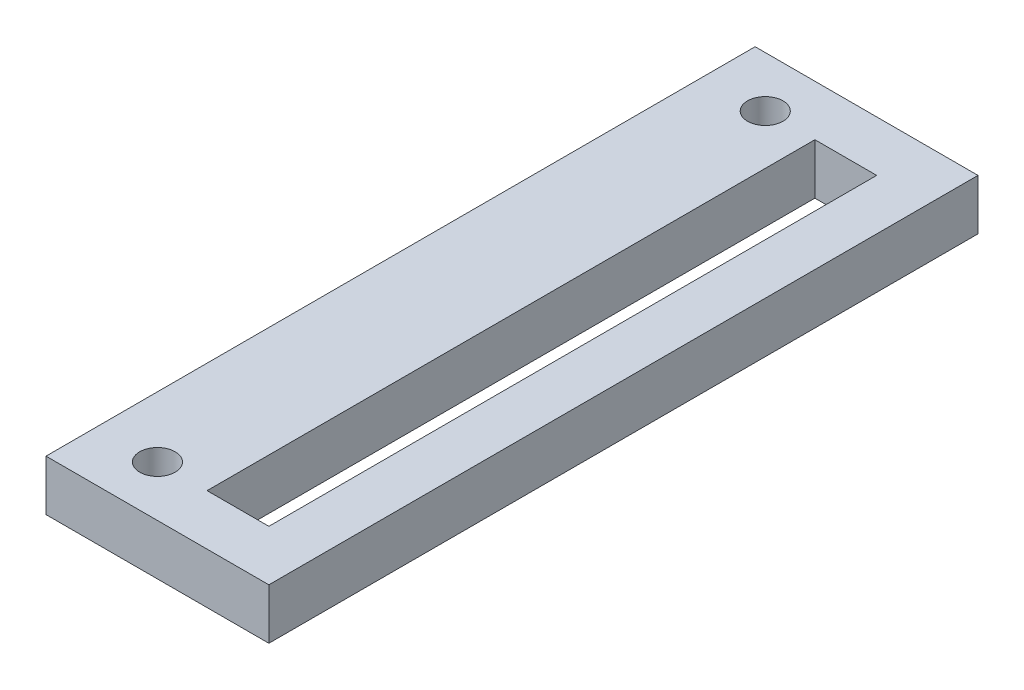
ISO-10303-21;
HEADER;
FILE_DESCRIPTION(('STEP AP214'),'2;1');
FILE_NAME('part.step','',(''),(''),'','','');
FILE_SCHEMA(('AUTOMOTIVE_DESIGN { 1 0 10303 214 1 1 1 1 }'));
ENDSEC;
DATA;
#1=APPLICATION_CONTEXT('core data for automotive mechanical design processes');
#2=APPLICATION_PROTOCOL_DEFINITION('international standard','automotive_design',2000,#1);
#3=PRODUCT_CONTEXT('',#1,'mechanical');
#4=PRODUCT('Part','Part','',(#3));
#5=PRODUCT_RELATED_PRODUCT_CATEGORY('part','',(#4));
#6=PRODUCT_DEFINITION_FORMATION('','',#4);
#7=PRODUCT_DEFINITION_CONTEXT('part definition',#1,'design');
#8=PRODUCT_DEFINITION('design','',#6,#7);
#9=PRODUCT_DEFINITION_SHAPE('','',#8);
#10=(LENGTH_UNIT() NAMED_UNIT(*) SI_UNIT(.MILLI.,.METRE.));
#11=(NAMED_UNIT(*) PLANE_ANGLE_UNIT() SI_UNIT($,.RADIAN.));
#12=(NAMED_UNIT(*) SI_UNIT($,.STERADIAN.) SOLID_ANGLE_UNIT());
#13=UNCERTAINTY_MEASURE_WITH_UNIT(LENGTH_MEASURE(1.E-05),#10,'distance_accuracy_value','');
#14=(GEOMETRIC_REPRESENTATION_CONTEXT(3) GLOBAL_UNCERTAINTY_ASSIGNED_CONTEXT((#13)) GLOBAL_UNIT_ASSIGNED_CONTEXT((#10,
#11,#12)) REPRESENTATION_CONTEXT('',''));
#15=CARTESIAN_POINT('',(0.,0.,0.));
#16=DIRECTION('',(0.,0.,1.));
#17=DIRECTION('',(1.,0.,0.));
#18=AXIS2_PLACEMENT_3D('',#15,#16,#17);
#19=CARTESIAN_POINT('',(0.,5.,0.));
#20=DIRECTION('',(0.,-1.,0.));
#21=DIRECTION('',(0.,0.,-1.));
#22=AXIS2_PLACEMENT_3D('',#19,#20,#21);
#23=PLANE('',#22);
#24=CARTESIAN_POINT('',(6.00000000000001,5.,-5.));
#25=DIRECTION('',(0.,1.,0.));
#26=DIRECTION('',(0.,0.,-1.));
#27=AXIS2_PLACEMENT_3D('',#24,#25,#26);
#28=CIRCLE('',#27,1.75);
#29=CARTESIAN_POINT('',(6.00000000000001,5.,-6.75000000000001));
#30=VERTEX_POINT('',#29);
#31=EDGE_CURVE('E137',#30,#30,#28,.T.);
#32=ORIENTED_EDGE('',*,*,#31,.F.);
#33=EDGE_LOOP('',(#32));
#34=FACE_BOUND('',#33,.T.);
#35=CARTESIAN_POINT('',(6.00000000000001,5.,-65.));
#36=DIRECTION('',(0.,1.,0.));
#37=DIRECTION('',(0.,0.,1.));
#38=AXIS2_PLACEMENT_3D('',#35,#36,#37);
#39=CIRCLE('',#38,1.75);
#40=CARTESIAN_POINT('',(6.00000000000001,5.,-63.25));
#41=VERTEX_POINT('',#40);
#42=EDGE_CURVE('E143',#41,#41,#39,.T.);
#43=ORIENTED_EDGE('',*,*,#42,.F.);
#44=EDGE_LOOP('',(#43));
#45=FACE_BOUND('',#44,.T.);
#46=DIRECTION('',(0.,0.,1.));
#47=VECTOR('',#46,1.);
#48=CARTESIAN_POINT('',(0.,5.,0.));
#49=LINE('',#48,#47);
#50=CARTESIAN_POINT('',(0.,5.,-70.));
#51=VERTEX_POINT('',#50);
#52=CARTESIAN_POINT('',(0.,5.,0.));
#53=VERTEX_POINT('',#52);
#54=EDGE_CURVE('E149',#51,#53,#49,.T.);
#55=ORIENTED_EDGE('',*,*,#54,.T.);
#56=DIRECTION('',(1.,0.,0.));
#57=VECTOR('',#56,1.);
#58=CARTESIAN_POINT('',(0.,5.,0.));
#59=LINE('',#58,#57);
#60=CARTESIAN_POINT('',(22.,5.,0.));
#61=VERTEX_POINT('',#60);
#62=EDGE_CURVE('E152',#53,#61,#59,.T.);
#63=ORIENTED_EDGE('',*,*,#62,.T.);
#64=DIRECTION('',(0.,0.,-1.));
#65=VECTOR('',#64,1.);
#66=CARTESIAN_POINT('',(22.,5.,0.));
#67=LINE('',#66,#65);
#68=CARTESIAN_POINT('',(22.,5.,-70.));
#69=VERTEX_POINT('',#68);
#70=EDGE_CURVE('E155',#61,#69,#67,.T.);
#71=ORIENTED_EDGE('',*,*,#70,.T.);
#72=DIRECTION('',(-1.,0.,0.));
#73=VECTOR('',#72,1.);
#74=CARTESIAN_POINT('',(0.,5.,-70.));
#75=LINE('',#74,#73);
#76=EDGE_CURVE('E157',#69,#51,#75,.T.);
#77=ORIENTED_EDGE('',*,*,#76,.T.);
#78=EDGE_LOOP('',(#55,#63,#71,#77));
#79=FACE_BOUND('',#78,.T.);
#80=DIRECTION('',(0.,0.,-1.));
#81=VECTOR('',#80,1.);
#82=CARTESIAN_POINT('',(17.,5.,-65.));
#83=LINE('',#82,#81);
#84=CARTESIAN_POINT('',(17.,5.,-5.00000000000001));
#85=VERTEX_POINT('',#84);
#86=CARTESIAN_POINT('',(17.,5.,-65.));
#87=VERTEX_POINT('',#86);
#88=EDGE_CURVE('E101',#85,#87,#83,.T.);
#89=ORIENTED_EDGE('',*,*,#88,.F.);
#90=DIRECTION('',(1.,0.,0.));
#91=VECTOR('',#90,1.);
#92=CARTESIAN_POINT('',(17.,5.,-5.00000000000001));
#93=LINE('',#92,#91);
#94=CARTESIAN_POINT('',(10.9,5.,-5.00000000000001));
#95=VERTEX_POINT('',#94);
#96=EDGE_CURVE('E123',#95,#85,#93,.T.);
#97=ORIENTED_EDGE('',*,*,#96,.F.);
#98=DIRECTION('',(0.,0.,1.));
#99=VECTOR('',#98,1.);
#100=CARTESIAN_POINT('',(10.9,5.,-65.));
#101=LINE('',#100,#99);
#102=CARTESIAN_POINT('',(10.9,5.,-65.));
#103=VERTEX_POINT('',#102);
#104=EDGE_CURVE('E121',#103,#95,#101,.T.);
#105=ORIENTED_EDGE('',*,*,#104,.F.);
#106=DIRECTION('',(-1.,0.,0.));
#107=VECTOR('',#106,1.);
#108=CARTESIAN_POINT('',(17.,5.,-65.));
#109=LINE('',#108,#107);
#110=EDGE_CURVE('E109',#87,#103,#109,.T.);
#111=ORIENTED_EDGE('',*,*,#110,.F.);
#112=EDGE_LOOP('',(#89,#97,#105,#111));
#113=FACE_BOUND('',#112,.T.);
#114=ADVANCED_FACE('F36',(#34,#45,#79,#113),#23,.F.);
#115=CARTESIAN_POINT('',(0.,0.,0.));
#116=DIRECTION('',(0.,-1.,0.));
#117=DIRECTION('',(0.,0.,-1.));
#118=AXIS2_PLACEMENT_3D('',#115,#116,#117);
#119=PLANE('',#118);
#120=CARTESIAN_POINT('',(6.00000000000001,0.,-65.));
#121=DIRECTION('',(0.,1.,0.));
#122=DIRECTION('',(0.,0.,1.));
#123=AXIS2_PLACEMENT_3D('',#120,#121,#122);
#124=CIRCLE('',#123,1.75);
#125=CARTESIAN_POINT('',(6.00000000000001,0.,-63.25));
#126=VERTEX_POINT('',#125);
#127=EDGE_CURVE('E140',#126,#126,#124,.T.);
#128=ORIENTED_EDGE('',*,*,#127,.T.);
#129=EDGE_LOOP('',(#128));
#130=FACE_BOUND('',#129,.T.);
#131=DIRECTION('',(0.,0.,1.));
#132=VECTOR('',#131,1.);
#133=CARTESIAN_POINT('',(0.,0.,0.));
#134=LINE('',#133,#132);
#135=CARTESIAN_POINT('',(0.,0.,-70.));
#136=VERTEX_POINT('',#135);
#137=CARTESIAN_POINT('',(0.,0.,0.));
#138=VERTEX_POINT('',#137);
#139=EDGE_CURVE('E146',#136,#138,#134,.T.);
#140=ORIENTED_EDGE('',*,*,#139,.F.);
#141=DIRECTION('',(-1.,0.,0.));
#142=VECTOR('',#141,1.);
#143=CARTESIAN_POINT('',(0.,0.,-70.));
#144=LINE('',#143,#142);
#145=CARTESIAN_POINT('',(22.,0.,-70.));
#146=VERTEX_POINT('',#145);
#147=EDGE_CURVE('E153',#146,#136,#144,.T.);
#148=ORIENTED_EDGE('',*,*,#147,.F.);
#149=DIRECTION('',(0.,0.,-1.));
#150=VECTOR('',#149,1.);
#151=CARTESIAN_POINT('',(22.,0.,0.));
#152=LINE('',#151,#150);
#153=CARTESIAN_POINT('',(22.,0.,0.));
#154=VERTEX_POINT('',#153);
#155=EDGE_CURVE('E164',#154,#146,#152,.T.);
#156=ORIENTED_EDGE('',*,*,#155,.F.);
#157=DIRECTION('',(1.,0.,0.));
#158=VECTOR('',#157,1.);
#159=CARTESIAN_POINT('',(0.,0.,0.));
#160=LINE('',#159,#158);
#161=EDGE_CURVE('E162',#138,#154,#160,.T.);
#162=ORIENTED_EDGE('',*,*,#161,.F.);
#163=EDGE_LOOP('',(#140,#148,#156,#162));
#164=FACE_BOUND('',#163,.T.);
#165=CARTESIAN_POINT('',(6.00000000000001,0.,-5.));
#166=DIRECTION('',(0.,1.,0.));
#167=DIRECTION('',(0.,0.,-1.));
#168=AXIS2_PLACEMENT_3D('',#165,#166,#167);
#169=CIRCLE('',#168,1.75);
#170=CARTESIAN_POINT('',(6.00000000000001,0.,-6.75000000000001));
#171=VERTEX_POINT('',#170);
#172=EDGE_CURVE('E117',#171,#171,#169,.T.);
#173=ORIENTED_EDGE('',*,*,#172,.T.);
#174=EDGE_LOOP('',(#173));
#175=FACE_BOUND('',#174,.T.);
#176=DIRECTION('',(1.,0.,0.));
#177=VECTOR('',#176,1.);
#178=CARTESIAN_POINT('',(17.,0.,-5.00000000000001));
#179=LINE('',#178,#177);
#180=CARTESIAN_POINT('',(10.9,0.,-5.00000000000001));
#181=VERTEX_POINT('',#180);
#182=CARTESIAN_POINT('',(17.,0.,-5.00000000000001));
#183=VERTEX_POINT('',#182);
#184=EDGE_CURVE('E110',#181,#183,#179,.T.);
#185=ORIENTED_EDGE('',*,*,#184,.T.);
#186=DIRECTION('',(0.,0.,-1.));
#187=VECTOR('',#186,1.);
#188=CARTESIAN_POINT('',(17.,0.,-65.));
#189=LINE('',#188,#187);
#190=CARTESIAN_POINT('',(17.,0.,-65.));
#191=VERTEX_POINT('',#190);
#192=EDGE_CURVE('E59',#183,#191,#189,.T.);
#193=ORIENTED_EDGE('',*,*,#192,.T.);
#194=DIRECTION('',(-1.,0.,0.));
#195=VECTOR('',#194,1.);
#196=CARTESIAN_POINT('',(17.,0.,-65.));
#197=LINE('',#196,#195);
#198=CARTESIAN_POINT('',(10.9,0.,-65.));
#199=VERTEX_POINT('',#198);
#200=EDGE_CURVE('E116',#191,#199,#197,.T.);
#201=ORIENTED_EDGE('',*,*,#200,.T.);
#202=DIRECTION('',(0.,0.,1.));
#203=VECTOR('',#202,1.);
#204=CARTESIAN_POINT('',(10.9,0.,-65.));
#205=LINE('',#204,#203);
#206=EDGE_CURVE('E129',#199,#181,#205,.T.);
#207=ORIENTED_EDGE('',*,*,#206,.T.);
#208=EDGE_LOOP('',(#185,#193,#201,#207));
#209=FACE_BOUND('',#208,.T.);
#210=ADVANCED_FACE('F182',(#130,#164,#175,#209),#119,.T.);
#211=CARTESIAN_POINT('',(0.,5.,0.));
#212=DIRECTION('',(1.,0.,0.));
#213=DIRECTION('',(0.,0.,-1.));
#214=AXIS2_PLACEMENT_3D('',#211,#212,#213);
#215=PLANE('',#214);
#216=ORIENTED_EDGE('',*,*,#139,.T.);
#217=DIRECTION('',(0.,-1.,0.));
#218=VECTOR('',#217,1.);
#219=CARTESIAN_POINT('',(0.,5.,0.));
#220=LINE('',#219,#218);
#221=EDGE_CURVE('E11',#53,#138,#220,.T.);
#222=ORIENTED_EDGE('',*,*,#221,.F.);
#223=ORIENTED_EDGE('',*,*,#54,.F.);
#224=DIRECTION('',(0.,-1.,0.));
#225=VECTOR('',#224,1.);
#226=CARTESIAN_POINT('',(0.,5.,-70.));
#227=LINE('',#226,#225);
#228=EDGE_CURVE('E159',#51,#136,#227,.T.);
#229=ORIENTED_EDGE('',*,*,#228,.T.);
#230=EDGE_LOOP('',(#216,#222,#223,#229));
#231=FACE_BOUND('',#230,.T.);
#232=ADVANCED_FACE('F38',(#231),#215,.F.);
#233=CARTESIAN_POINT('',(0.,5.,0.));
#234=DIRECTION('',(0.,0.,-1.));
#235=DIRECTION('',(-1.,0.,0.));
#236=AXIS2_PLACEMENT_3D('',#233,#234,#235);
#237=PLANE('',#236);
#238=ORIENTED_EDGE('',*,*,#161,.T.);
#239=DIRECTION('',(0.,-1.,0.));
#240=VECTOR('',#239,1.);
#241=CARTESIAN_POINT('',(22.,5.,0.));
#242=LINE('',#241,#240);
#243=EDGE_CURVE('E44',#61,#154,#242,.T.);
#244=ORIENTED_EDGE('',*,*,#243,.F.);
#245=ORIENTED_EDGE('',*,*,#62,.F.);
#246=ORIENTED_EDGE('',*,*,#221,.T.);
#247=EDGE_LOOP('',(#238,#244,#245,#246));
#248=FACE_BOUND('',#247,.T.);
#249=ADVANCED_FACE('F192',(#248),#237,.F.);
#250=CARTESIAN_POINT('',(22.,5.,0.));
#251=DIRECTION('',(-1.,0.,0.));
#252=DIRECTION('',(0.,0.,1.));
#253=AXIS2_PLACEMENT_3D('',#250,#251,#252);
#254=PLANE('',#253);
#255=ORIENTED_EDGE('',*,*,#155,.T.);
#256=DIRECTION('',(0.,-1.,0.));
#257=VECTOR('',#256,1.);
#258=CARTESIAN_POINT('',(22.,5.,-70.));
#259=LINE('',#258,#257);
#260=EDGE_CURVE('E169',#69,#146,#259,.T.);
#261=ORIENTED_EDGE('',*,*,#260,.F.);
#262=ORIENTED_EDGE('',*,*,#70,.F.);
#263=ORIENTED_EDGE('',*,*,#243,.T.);
#264=EDGE_LOOP('',(#255,#261,#262,#263));
#265=FACE_BOUND('',#264,.T.);
#266=ADVANCED_FACE('F176',(#265),#254,.F.);
#267=CARTESIAN_POINT('',(0.,5.,-70.));
#268=DIRECTION('',(0.,0.,1.));
#269=DIRECTION('',(1.,0.,0.));
#270=AXIS2_PLACEMENT_3D('',#267,#268,#269);
#271=PLANE('',#270);
#272=ORIENTED_EDGE('',*,*,#147,.T.);
#273=ORIENTED_EDGE('',*,*,#228,.F.);
#274=ORIENTED_EDGE('',*,*,#76,.F.);
#275=ORIENTED_EDGE('',*,*,#260,.T.);
#276=EDGE_LOOP('',(#272,#273,#274,#275));
#277=FACE_BOUND('',#276,.T.);
#278=ADVANCED_FACE('F186',(#277),#271,.F.);
#279=CARTESIAN_POINT('',(6.00000000000001,5.,-65.));
#280=DIRECTION('',(0.,-1.,0.));
#281=DIRECTION('',(0.,0.,-1.));
#282=AXIS2_PLACEMENT_3D('',#279,#280,#281);
#283=CYLINDRICAL_SURFACE('',#282,1.75);
#284=ORIENTED_EDGE('',*,*,#42,.T.);
#285=EDGE_LOOP('',(#284));
#286=FACE_BOUND('',#285,.T.);
#287=ORIENTED_EDGE('',*,*,#127,.F.);
#288=EDGE_LOOP('',(#287));
#289=FACE_BOUND('',#288,.T.);
#290=ADVANCED_FACE('F210',(#286,#289),#283,.F.);
#291=CARTESIAN_POINT('',(6.00000000000001,5.,-5.));
#292=DIRECTION('',(0.,-1.,0.));
#293=DIRECTION('',(0.,0.,-1.));
#294=AXIS2_PLACEMENT_3D('',#291,#292,#293);
#295=CYLINDRICAL_SURFACE('',#294,1.75);
#296=ORIENTED_EDGE('',*,*,#31,.T.);
#297=EDGE_LOOP('',(#296));
#298=FACE_BOUND('',#297,.T.);
#299=ORIENTED_EDGE('',*,*,#172,.F.);
#300=EDGE_LOOP('',(#299));
#301=FACE_BOUND('',#300,.T.);
#302=ADVANCED_FACE('F217',(#298,#301),#295,.F.);
#303=CARTESIAN_POINT('',(17.,5.,-65.));
#304=DIRECTION('',(-1.,0.,0.));
#305=DIRECTION('',(0.,0.,1.));
#306=AXIS2_PLACEMENT_3D('',#303,#304,#305);
#307=PLANE('',#306);
#308=ORIENTED_EDGE('',*,*,#192,.F.);
#309=DIRECTION('',(0.,-1.,0.));
#310=VECTOR('',#309,1.);
#311=CARTESIAN_POINT('',(17.,5.,-5.00000000000001));
#312=LINE('',#311,#310);
#313=EDGE_CURVE('E105',#85,#183,#312,.T.);
#314=ORIENTED_EDGE('',*,*,#313,.F.);
#315=ORIENTED_EDGE('',*,*,#88,.T.);
#316=DIRECTION('',(0.,-1.,0.));
#317=VECTOR('',#316,1.);
#318=CARTESIAN_POINT('',(17.,5.,-65.));
#319=LINE('',#318,#317);
#320=EDGE_CURVE('E104',#87,#191,#319,.T.);
#321=ORIENTED_EDGE('',*,*,#320,.T.);
#322=EDGE_LOOP('',(#308,#314,#315,#321));
#323=FACE_BOUND('',#322,.T.);
#324=ADVANCED_FACE('F103',(#323),#307,.T.);
#325=CARTESIAN_POINT('',(17.,5.,-65.));
#326=DIRECTION('',(0.,0.,1.));
#327=DIRECTION('',(1.,0.,0.));
#328=AXIS2_PLACEMENT_3D('',#325,#326,#327);
#329=PLANE('',#328);
#330=ORIENTED_EDGE('',*,*,#200,.F.);
#331=ORIENTED_EDGE('',*,*,#320,.F.);
#332=ORIENTED_EDGE('',*,*,#110,.T.);
#333=DIRECTION('',(0.,-1.,0.));
#334=VECTOR('',#333,1.);
#335=CARTESIAN_POINT('',(10.9,5.,-65.));
#336=LINE('',#335,#334);
#337=EDGE_CURVE('E118',#103,#199,#336,.T.);
#338=ORIENTED_EDGE('',*,*,#337,.T.);
#339=EDGE_LOOP('',(#330,#331,#332,#338));
#340=FACE_BOUND('',#339,.T.);
#341=ADVANCED_FACE('F113',(#340),#329,.T.);
#342=CARTESIAN_POINT('',(10.9,5.,-65.));
#343=DIRECTION('',(1.,0.,0.));
#344=DIRECTION('',(0.,0.,-1.));
#345=AXIS2_PLACEMENT_3D('',#342,#343,#344);
#346=PLANE('',#345);
#347=ORIENTED_EDGE('',*,*,#206,.F.);
#348=ORIENTED_EDGE('',*,*,#337,.F.);
#349=ORIENTED_EDGE('',*,*,#104,.T.);
#350=DIRECTION('',(0.,-1.,0.));
#351=VECTOR('',#350,1.);
#352=CARTESIAN_POINT('',(10.9,5.,-5.00000000000001));
#353=LINE('',#352,#351);
#354=EDGE_CURVE('E51',#95,#181,#353,.T.);
#355=ORIENTED_EDGE('',*,*,#354,.T.);
#356=EDGE_LOOP('',(#347,#348,#349,#355));
#357=FACE_BOUND('',#356,.T.);
#358=ADVANCED_FACE('F234',(#357),#346,.T.);
#359=CARTESIAN_POINT('',(17.,5.,-5.00000000000001));
#360=DIRECTION('',(0.,0.,-1.));
#361=DIRECTION('',(-1.,0.,0.));
#362=AXIS2_PLACEMENT_3D('',#359,#360,#361);
#363=PLANE('',#362);
#364=ORIENTED_EDGE('',*,*,#184,.F.);
#365=ORIENTED_EDGE('',*,*,#354,.F.);
#366=ORIENTED_EDGE('',*,*,#96,.T.);
#367=ORIENTED_EDGE('',*,*,#313,.T.);
#368=EDGE_LOOP('',(#364,#365,#366,#367));
#369=FACE_BOUND('',#368,.T.);
#370=ADVANCED_FACE('F237',(#369),#363,.T.);
#371=CLOSED_SHELL('',(#114,#210,#232,#249,#266,#278,#290,#302,#324,#341,#358,#370));
#372=MANIFOLD_SOLID_BREP('B2',#371);
#373=ADVANCED_BREP_SHAPE_REPRESENTATION('',(#18,#372),#14);
#374=SHAPE_DEFINITION_REPRESENTATION(#9,#373);
ENDSEC;
END-ISO-10303-21;
